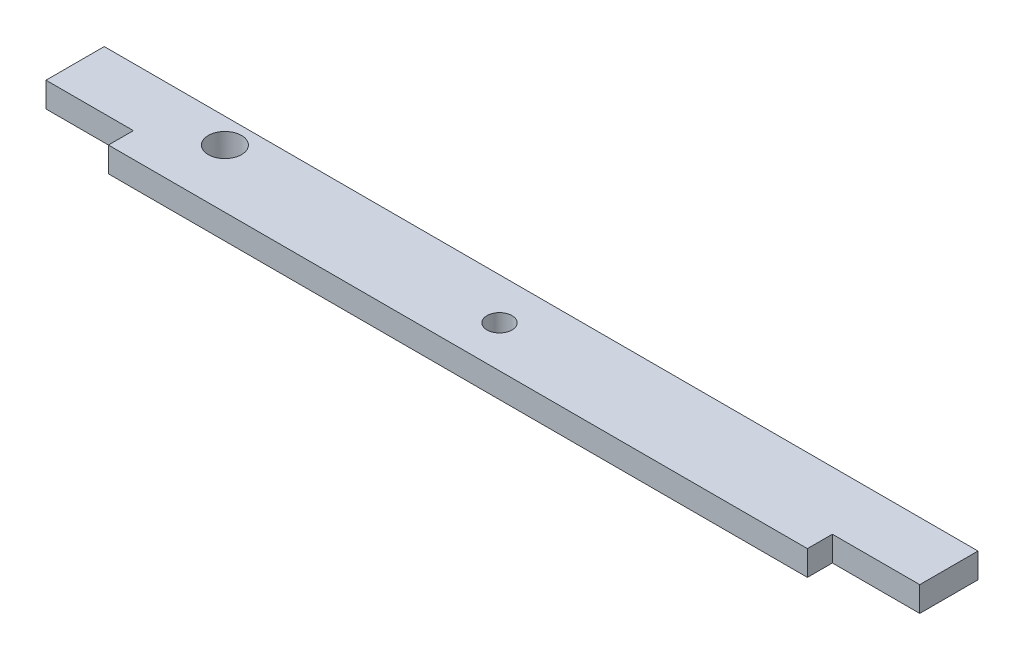
ISO-10303-21;
HEADER;
FILE_DESCRIPTION(('STEP AP214'),'2;1');
FILE_NAME('part.step','',(''),(''),'','','');
FILE_SCHEMA(('AUTOMOTIVE_DESIGN { 1 0 10303 214 1 1 1 1 }'));
ENDSEC;
DATA;
#1=APPLICATION_CONTEXT('core data for automotive mechanical design processes');
#2=APPLICATION_PROTOCOL_DEFINITION('international standard','automotive_design',2000,#1);
#3=PRODUCT_CONTEXT('',#1,'mechanical');
#4=PRODUCT('Part','Part','',(#3));
#5=PRODUCT_RELATED_PRODUCT_CATEGORY('part','',(#4));
#6=PRODUCT_DEFINITION_FORMATION('','',#4);
#7=PRODUCT_DEFINITION_CONTEXT('part definition',#1,'design');
#8=PRODUCT_DEFINITION('design','',#6,#7);
#9=PRODUCT_DEFINITION_SHAPE('','',#8);
#10=(LENGTH_UNIT() NAMED_UNIT(*) SI_UNIT(.MILLI.,.METRE.));
#11=(NAMED_UNIT(*) PLANE_ANGLE_UNIT() SI_UNIT($,.RADIAN.));
#12=(NAMED_UNIT(*) SI_UNIT($,.STERADIAN.) SOLID_ANGLE_UNIT());
#13=UNCERTAINTY_MEASURE_WITH_UNIT(LENGTH_MEASURE(1.E-05),#10,'distance_accuracy_value','');
#14=(GEOMETRIC_REPRESENTATION_CONTEXT(3) GLOBAL_UNCERTAINTY_ASSIGNED_CONTEXT((#13)) GLOBAL_UNIT_ASSIGNED_CONTEXT((#10,
#11,#12)) REPRESENTATION_CONTEXT('',''));
#15=CARTESIAN_POINT('',(0.,0.,0.));
#16=DIRECTION('',(0.,0.,1.));
#17=DIRECTION('',(1.,0.,0.));
#18=AXIS2_PLACEMENT_3D('',#15,#16,#17);
#19=CARTESIAN_POINT('',(0.,3.,0.));
#20=DIRECTION('',(0.,1.,0.));
#21=DIRECTION('',(0.,0.,1.));
#22=AXIS2_PLACEMENT_3D('',#19,#20,#21);
#23=PLANE('',#22);
#24=CARTESIAN_POINT('',(-35.,3.,-2.));
#25=DIRECTION('',(0.,1.,0.));
#26=DIRECTION('',(0.,0.,1.));
#27=AXIS2_PLACEMENT_3D('',#24,#25,#26);
#28=CIRCLE('',#27,2.);
#29=CARTESIAN_POINT('',(-35.,3.,0.));
#30=VERTEX_POINT('',#29);
#31=EDGE_CURVE('E179',#30,#30,#28,.T.);
#32=ORIENTED_EDGE('',*,*,#31,.F.);
#33=EDGE_LOOP('',(#32));
#34=FACE_BOUND('',#33,.T.);
#35=CARTESIAN_POINT('',(0.,3.,0.));
#36=DIRECTION('',(0.,1.,0.));
#37=DIRECTION('',(0.,0.,1.));
#38=AXIS2_PLACEMENT_3D('',#35,#36,#37);
#39=CIRCLE('',#38,1.5);
#40=CARTESIAN_POINT('',(0.,3.,1.5));
#41=VERTEX_POINT('',#40);
#42=EDGE_CURVE('E125',#41,#41,#39,.T.);
#43=ORIENTED_EDGE('',*,*,#42,.F.);
#44=EDGE_LOOP('',(#43));
#45=FACE_BOUND('',#44,.T.);
#46=DIRECTION('',(1.,0.,0.));
#47=VECTOR('',#46,1.);
#48=CARTESIAN_POINT('',(-52.5,3.,5.));
#49=LINE('',#48,#47);
#50=CARTESIAN_POINT('',(-42.,3.,5.));
#51=VERTEX_POINT('',#50);
#52=CARTESIAN_POINT('',(42.,3.,5.));
#53=VERTEX_POINT('',#52);
#54=EDGE_CURVE('E133',#51,#53,#49,.T.);
#55=ORIENTED_EDGE('',*,*,#54,.T.);
#56=DIRECTION('',(0.,0.,-1.));
#57=VECTOR('',#56,1.);
#58=CARTESIAN_POINT('',(42.,3.,5.));
#59=LINE('',#58,#57);
#60=CARTESIAN_POINT('',(42.,3.,2.));
#61=VERTEX_POINT('',#60);
#62=EDGE_CURVE('E53',#53,#61,#59,.T.);
#63=ORIENTED_EDGE('',*,*,#62,.T.);
#64=DIRECTION('',(1.,0.,0.));
#65=VECTOR('',#64,1.);
#66=CARTESIAN_POINT('',(42.,3.,2.));
#67=LINE('',#66,#65);
#68=CARTESIAN_POINT('',(52.5,3.,2.));
#69=VERTEX_POINT('',#68);
#70=EDGE_CURVE('E177',#61,#69,#67,.T.);
#71=ORIENTED_EDGE('',*,*,#70,.T.);
#72=DIRECTION('',(0.,0.,-1.));
#73=VECTOR('',#72,1.);
#74=CARTESIAN_POINT('',(52.5,3.,-5.));
#75=LINE('',#74,#73);
#76=CARTESIAN_POINT('',(52.5,3.,-5.));
#77=VERTEX_POINT('',#76);
#78=EDGE_CURVE('E120',#69,#77,#75,.T.);
#79=ORIENTED_EDGE('',*,*,#78,.T.);
#80=DIRECTION('',(-1.,0.,0.));
#81=VECTOR('',#80,1.);
#82=CARTESIAN_POINT('',(-52.5,3.,-5.));
#83=LINE('',#82,#81);
#84=CARTESIAN_POINT('',(-52.5,3.,-5.));
#85=VERTEX_POINT('',#84);
#86=EDGE_CURVE('E150',#77,#85,#83,.T.);
#87=ORIENTED_EDGE('',*,*,#86,.T.);
#88=DIRECTION('',(0.,0.,1.));
#89=VECTOR('',#88,1.);
#90=CARTESIAN_POINT('',(-52.5,3.,-5.));
#91=LINE('',#90,#89);
#92=CARTESIAN_POINT('',(-52.5,3.,2.));
#93=VERTEX_POINT('',#92);
#94=EDGE_CURVE('E145',#85,#93,#91,.T.);
#95=ORIENTED_EDGE('',*,*,#94,.T.);
#96=DIRECTION('',(-1.,0.,0.));
#97=VECTOR('',#96,1.);
#98=CARTESIAN_POINT('',(-42.,3.,2.));
#99=LINE('',#98,#97);
#100=CARTESIAN_POINT('',(-42.,3.,2.));
#101=VERTEX_POINT('',#100);
#102=EDGE_CURVE('E165',#101,#93,#99,.T.);
#103=ORIENTED_EDGE('',*,*,#102,.F.);
#104=DIRECTION('',(0.,0.,-1.));
#105=VECTOR('',#104,1.);
#106=CARTESIAN_POINT('',(-42.,3.,5.));
#107=LINE('',#106,#105);
#108=EDGE_CURVE('E167',#51,#101,#107,.T.);
#109=ORIENTED_EDGE('',*,*,#108,.F.);
#110=EDGE_LOOP('',(#55,#63,#71,#79,#87,#95,#103,#109));
#111=FACE_BOUND('',#110,.T.);
#112=ADVANCED_FACE('F38',(#34,#45,#111),#23,.T.);
#113=CARTESIAN_POINT('',(0.,0.,0.));
#114=DIRECTION('',(0.,1.,0.));
#115=DIRECTION('',(0.,0.,1.));
#116=AXIS2_PLACEMENT_3D('',#113,#114,#115);
#117=PLANE('',#116);
#118=CARTESIAN_POINT('',(-35.,0.,-2.));
#119=DIRECTION('',(0.,-1.,0.));
#120=DIRECTION('',(0.,0.,-1.));
#121=AXIS2_PLACEMENT_3D('',#118,#119,#120);
#122=CIRCLE('',#121,2.);
#123=CARTESIAN_POINT('',(-35.,0.,-4.00000000000001));
#124=VERTEX_POINT('',#123);
#125=EDGE_CURVE('E183',#124,#124,#122,.T.);
#126=ORIENTED_EDGE('',*,*,#125,.F.);
#127=EDGE_LOOP('',(#126));
#128=FACE_BOUND('',#127,.T.);
#129=CARTESIAN_POINT('',(0.,0.,0.));
#130=DIRECTION('',(0.,1.,0.));
#131=DIRECTION('',(0.,0.,1.));
#132=AXIS2_PLACEMENT_3D('',#129,#130,#131);
#133=CIRCLE('',#132,1.5);
#134=CARTESIAN_POINT('',(0.,0.,1.5));
#135=VERTEX_POINT('',#134);
#136=EDGE_CURVE('E130',#135,#135,#133,.T.);
#137=ORIENTED_EDGE('',*,*,#136,.T.);
#138=EDGE_LOOP('',(#137));
#139=FACE_BOUND('',#138,.T.);
#140=DIRECTION('',(0.,0.,-1.));
#141=VECTOR('',#140,1.);
#142=CARTESIAN_POINT('',(42.,0.,5.));
#143=LINE('',#142,#141);
#144=CARTESIAN_POINT('',(42.,0.,5.));
#145=VERTEX_POINT('',#144);
#146=CARTESIAN_POINT('',(42.,0.,2.));
#147=VERTEX_POINT('',#146);
#148=EDGE_CURVE('E113',#145,#147,#143,.T.);
#149=ORIENTED_EDGE('',*,*,#148,.F.);
#150=DIRECTION('',(1.,0.,0.));
#151=VECTOR('',#150,1.);
#152=CARTESIAN_POINT('',(-52.5,0.,5.));
#153=LINE('',#152,#151);
#154=CARTESIAN_POINT('',(-42.,0.,5.));
#155=VERTEX_POINT('',#154);
#156=EDGE_CURVE('E138',#155,#145,#153,.T.);
#157=ORIENTED_EDGE('',*,*,#156,.F.);
#158=DIRECTION('',(0.,0.,-1.));
#159=VECTOR('',#158,1.);
#160=CARTESIAN_POINT('',(-42.,0.,5.));
#161=LINE('',#160,#159);
#162=CARTESIAN_POINT('',(-42.,0.,2.));
#163=VERTEX_POINT('',#162);
#164=EDGE_CURVE('E61',#155,#163,#161,.T.);
#165=ORIENTED_EDGE('',*,*,#164,.T.);
#166=DIRECTION('',(-1.,0.,0.));
#167=VECTOR('',#166,1.);
#168=CARTESIAN_POINT('',(-42.,0.,2.));
#169=LINE('',#168,#167);
#170=CARTESIAN_POINT('',(-52.5,0.,2.));
#171=VERTEX_POINT('',#170);
#172=EDGE_CURVE('E161',#163,#171,#169,.T.);
#173=ORIENTED_EDGE('',*,*,#172,.T.);
#174=DIRECTION('',(0.,0.,1.));
#175=VECTOR('',#174,1.);
#176=CARTESIAN_POINT('',(-52.5,0.,-5.));
#177=LINE('',#176,#175);
#178=CARTESIAN_POINT('',(-52.5,0.,-5.));
#179=VERTEX_POINT('',#178);
#180=EDGE_CURVE('E127',#179,#171,#177,.T.);
#181=ORIENTED_EDGE('',*,*,#180,.F.);
#182=DIRECTION('',(-1.,0.,0.));
#183=VECTOR('',#182,1.);
#184=CARTESIAN_POINT('',(-52.5,0.,-5.));
#185=LINE('',#184,#183);
#186=CARTESIAN_POINT('',(52.5,0.,-5.));
#187=VERTEX_POINT('',#186);
#188=EDGE_CURVE('E124',#187,#179,#185,.T.);
#189=ORIENTED_EDGE('',*,*,#188,.F.);
#190=DIRECTION('',(0.,0.,-1.));
#191=VECTOR('',#190,1.);
#192=CARTESIAN_POINT('',(52.5,0.,-5.));
#193=LINE('',#192,#191);
#194=CARTESIAN_POINT('',(52.5,0.,2.));
#195=VERTEX_POINT('',#194);
#196=EDGE_CURVE('E118',#195,#187,#193,.T.);
#197=ORIENTED_EDGE('',*,*,#196,.F.);
#198=DIRECTION('',(1.,0.,0.));
#199=VECTOR('',#198,1.);
#200=CARTESIAN_POINT('',(42.,0.,2.));
#201=LINE('',#200,#199);
#202=EDGE_CURVE('E103',#147,#195,#201,.T.);
#203=ORIENTED_EDGE('',*,*,#202,.F.);
#204=EDGE_LOOP('',(#149,#157,#165,#173,#181,#189,#197,#203));
#205=FACE_BOUND('',#204,.T.);
#206=ADVANCED_FACE('F122',(#128,#139,#205),#117,.F.);
#207=CARTESIAN_POINT('',(52.5,3.,-5.));
#208=DIRECTION('',(-1.,0.,0.));
#209=DIRECTION('',(0.,0.,1.));
#210=AXIS2_PLACEMENT_3D('',#207,#208,#209);
#211=PLANE('',#210);
#212=DIRECTION('',(0.,1.,0.));
#213=VECTOR('',#212,1.);
#214=CARTESIAN_POINT('',(52.5,0.,2.));
#215=LINE('',#214,#213);
#216=EDGE_CURVE('E107',#195,#69,#215,.T.);
#217=ORIENTED_EDGE('',*,*,#216,.F.);
#218=ORIENTED_EDGE('',*,*,#196,.T.);
#219=DIRECTION('',(0.,-1.,0.));
#220=VECTOR('',#219,1.);
#221=CARTESIAN_POINT('',(52.5,3.,-5.));
#222=LINE('',#221,#220);
#223=EDGE_CURVE('E11',#77,#187,#222,.T.);
#224=ORIENTED_EDGE('',*,*,#223,.F.);
#225=ORIENTED_EDGE('',*,*,#78,.F.);
#226=EDGE_LOOP('',(#217,#218,#224,#225));
#227=FACE_BOUND('',#226,.T.);
#228=ADVANCED_FACE('F40',(#227),#211,.F.);
#229=CARTESIAN_POINT('',(-52.5,3.,5.));
#230=DIRECTION('',(0.,0.,-1.));
#231=DIRECTION('',(-1.,0.,0.));
#232=AXIS2_PLACEMENT_3D('',#229,#230,#231);
#233=PLANE('',#232);
#234=DIRECTION('',(0.,1.,0.));
#235=VECTOR('',#234,1.);
#236=CARTESIAN_POINT('',(42.,0.,5.));
#237=LINE('',#236,#235);
#238=EDGE_CURVE('E170',#145,#53,#237,.T.);
#239=ORIENTED_EDGE('',*,*,#238,.T.);
#240=ORIENTED_EDGE('',*,*,#54,.F.);
#241=DIRECTION('',(0.,1.,0.));
#242=VECTOR('',#241,1.);
#243=CARTESIAN_POINT('',(-42.,0.,5.));
#244=LINE('',#243,#242);
#245=EDGE_CURVE('E158',#155,#51,#244,.T.);
#246=ORIENTED_EDGE('',*,*,#245,.F.);
#247=ORIENTED_EDGE('',*,*,#156,.T.);
#248=EDGE_LOOP('',(#239,#240,#246,#247));
#249=FACE_BOUND('',#248,.T.);
#250=ADVANCED_FACE('F218',(#249),#233,.F.);
#251=CARTESIAN_POINT('',(-52.5,3.,-5.));
#252=DIRECTION('',(0.,0.,1.));
#253=DIRECTION('',(1.,0.,0.));
#254=AXIS2_PLACEMENT_3D('',#251,#252,#253);
#255=PLANE('',#254);
#256=ORIENTED_EDGE('',*,*,#188,.T.);
#257=DIRECTION('',(0.,-1.,0.));
#258=VECTOR('',#257,1.);
#259=CARTESIAN_POINT('',(-52.5,3.,-5.));
#260=LINE('',#259,#258);
#261=EDGE_CURVE('E46',#85,#179,#260,.T.);
#262=ORIENTED_EDGE('',*,*,#261,.F.);
#263=ORIENTED_EDGE('',*,*,#86,.F.);
#264=ORIENTED_EDGE('',*,*,#223,.T.);
#265=EDGE_LOOP('',(#256,#262,#263,#264));
#266=FACE_BOUND('',#265,.T.);
#267=ADVANCED_FACE('F207',(#266),#255,.F.);
#268=CARTESIAN_POINT('',(-52.5,3.,-5.));
#269=DIRECTION('',(1.,0.,0.));
#270=DIRECTION('',(0.,0.,-1.));
#271=AXIS2_PLACEMENT_3D('',#268,#269,#270);
#272=PLANE('',#271);
#273=ORIENTED_EDGE('',*,*,#180,.T.);
#274=DIRECTION('',(0.,1.,0.));
#275=VECTOR('',#274,1.);
#276=CARTESIAN_POINT('',(-52.5,0.,2.));
#277=LINE('',#276,#275);
#278=EDGE_CURVE('E156',#171,#93,#277,.T.);
#279=ORIENTED_EDGE('',*,*,#278,.T.);
#280=ORIENTED_EDGE('',*,*,#94,.F.);
#281=ORIENTED_EDGE('',*,*,#261,.T.);
#282=EDGE_LOOP('',(#273,#279,#280,#281));
#283=FACE_BOUND('',#282,.T.);
#284=ADVANCED_FACE('F197',(#283),#272,.F.);
#285=CARTESIAN_POINT('',(0.,3.,0.));
#286=DIRECTION('',(0.,-1.,0.));
#287=DIRECTION('',(0.,0.,-1.));
#288=AXIS2_PLACEMENT_3D('',#285,#286,#287);
#289=CYLINDRICAL_SURFACE('',#288,1.5);
#290=ORIENTED_EDGE('',*,*,#42,.T.);
#291=EDGE_LOOP('',(#290));
#292=FACE_BOUND('',#291,.T.);
#293=ORIENTED_EDGE('',*,*,#136,.F.);
#294=EDGE_LOOP('',(#293));
#295=FACE_BOUND('',#294,.T.);
#296=ADVANCED_FACE('F194',(#292,#295),#289,.F.);
#297=CARTESIAN_POINT('',(-42.,0.,2.));
#298=DIRECTION('',(0.,0.,-1.));
#299=DIRECTION('',(-1.,0.,0.));
#300=AXIS2_PLACEMENT_3D('',#297,#298,#299);
#301=PLANE('',#300);
#302=ORIENTED_EDGE('',*,*,#102,.T.);
#303=ORIENTED_EDGE('',*,*,#278,.F.);
#304=ORIENTED_EDGE('',*,*,#172,.F.);
#305=DIRECTION('',(0.,1.,0.));
#306=VECTOR('',#305,1.);
#307=CARTESIAN_POINT('',(-42.,0.,2.));
#308=LINE('',#307,#306);
#309=EDGE_CURVE('E160',#163,#101,#308,.T.);
#310=ORIENTED_EDGE('',*,*,#309,.T.);
#311=EDGE_LOOP('',(#302,#303,#304,#310));
#312=FACE_BOUND('',#311,.T.);
#313=ADVANCED_FACE('F196',(#312),#301,.F.);
#314=CARTESIAN_POINT('',(-42.,0.,5.));
#315=DIRECTION('',(1.,0.,0.));
#316=DIRECTION('',(0.,0.,-1.));
#317=AXIS2_PLACEMENT_3D('',#314,#315,#316);
#318=PLANE('',#317);
#319=ORIENTED_EDGE('',*,*,#108,.T.);
#320=ORIENTED_EDGE('',*,*,#309,.F.);
#321=ORIENTED_EDGE('',*,*,#164,.F.);
#322=ORIENTED_EDGE('',*,*,#245,.T.);
#323=EDGE_LOOP('',(#319,#320,#321,#322));
#324=FACE_BOUND('',#323,.T.);
#325=ADVANCED_FACE('F204',(#324),#318,.F.);
#326=CARTESIAN_POINT('',(42.,0.,5.));
#327=DIRECTION('',(1.,0.,0.));
#328=DIRECTION('',(0.,0.,-1.));
#329=AXIS2_PLACEMENT_3D('',#326,#327,#328);
#330=PLANE('',#329);
#331=ORIENTED_EDGE('',*,*,#62,.F.);
#332=ORIENTED_EDGE('',*,*,#238,.F.);
#333=ORIENTED_EDGE('',*,*,#148,.T.);
#334=DIRECTION('',(0.,1.,0.));
#335=VECTOR('',#334,1.);
#336=CARTESIAN_POINT('',(42.,0.,2.));
#337=LINE('',#336,#335);
#338=EDGE_CURVE('E109',#147,#61,#337,.T.);
#339=ORIENTED_EDGE('',*,*,#338,.T.);
#340=EDGE_LOOP('',(#331,#332,#333,#339));
#341=FACE_BOUND('',#340,.T.);
#342=ADVANCED_FACE('F229',(#341),#330,.T.);
#343=CARTESIAN_POINT('',(42.,0.,2.));
#344=DIRECTION('',(0.,0.,1.));
#345=DIRECTION('',(1.,0.,0.));
#346=AXIS2_PLACEMENT_3D('',#343,#344,#345);
#347=PLANE('',#346);
#348=ORIENTED_EDGE('',*,*,#70,.F.);
#349=ORIENTED_EDGE('',*,*,#338,.F.);
#350=ORIENTED_EDGE('',*,*,#202,.T.);
#351=ORIENTED_EDGE('',*,*,#216,.T.);
#352=EDGE_LOOP('',(#348,#349,#350,#351));
#353=FACE_BOUND('',#352,.T.);
#354=ADVANCED_FACE('F106',(#353),#347,.T.);
#355=CARTESIAN_POINT('',(-35.,10.,-2.));
#356=DIRECTION('',(0.,-1.,0.));
#357=DIRECTION('',(0.,0.,-1.));
#358=AXIS2_PLACEMENT_3D('',#355,#356,#357);
#359=CYLINDRICAL_SURFACE('',#358,2.);
#360=ORIENTED_EDGE('',*,*,#31,.T.);
#361=EDGE_LOOP('',(#360));
#362=FACE_BOUND('',#361,.T.);
#363=ORIENTED_EDGE('',*,*,#125,.T.);
#364=EDGE_LOOP('',(#363));
#365=FACE_BOUND('',#364,.T.);
#366=ADVANCED_FACE('F187',(#362,#365),#359,.F.);
#367=CLOSED_SHELL('',(#112,#206,#228,#250,#267,#284,#296,#313,#325,#342,#354,#366));
#368=MANIFOLD_SOLID_BREP('B2',#367);
#369=ADVANCED_BREP_SHAPE_REPRESENTATION('',(#18,#368),#14);
#370=SHAPE_DEFINITION_REPRESENTATION(#9,#369);
ENDSEC;
END-ISO-10303-21;
